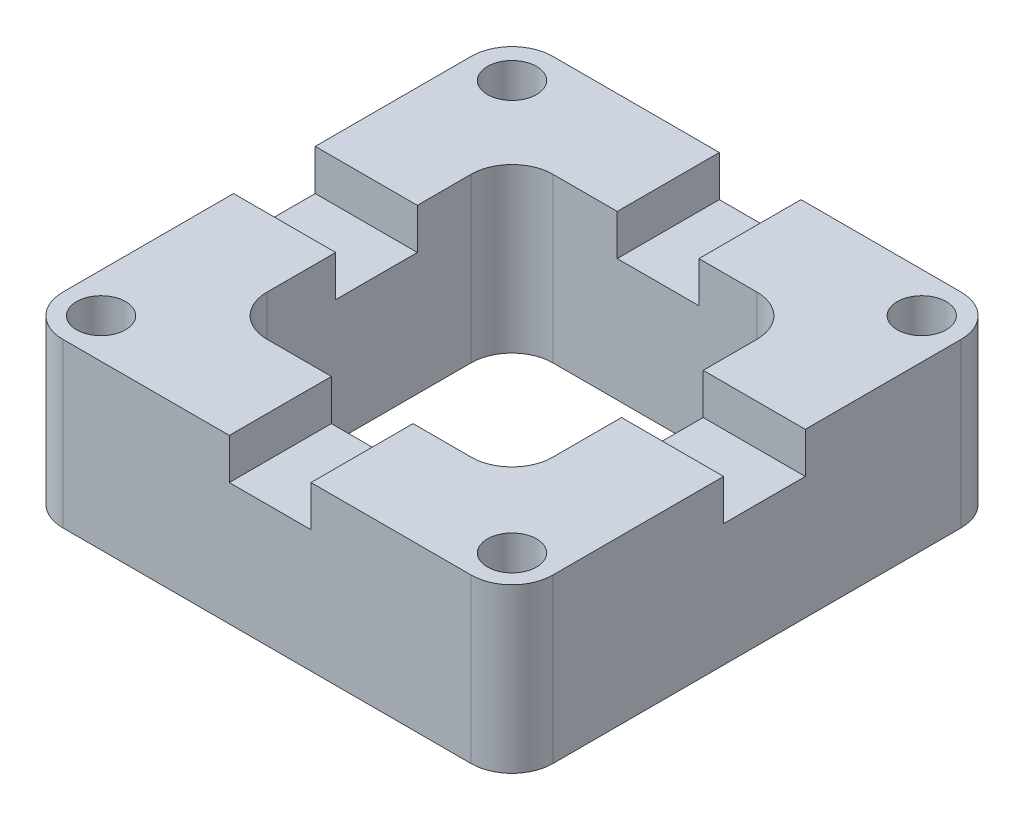
ISO-10303-21;
HEADER;
FILE_DESCRIPTION(('STEP AP214'),'2;1');
FILE_NAME('part.step','',(''),(''),'','','');
FILE_SCHEMA(('AUTOMOTIVE_DESIGN { 1 0 10303 214 1 1 1 1 }'));
ENDSEC;
DATA;
#1=APPLICATION_CONTEXT('core data for automotive mechanical design processes');
#2=APPLICATION_PROTOCOL_DEFINITION('international standard','automotive_design',2000,#1);
#3=PRODUCT_CONTEXT('',#1,'mechanical');
#4=PRODUCT('Part','Part','',(#3));
#5=PRODUCT_RELATED_PRODUCT_CATEGORY('part','',(#4));
#6=PRODUCT_DEFINITION_FORMATION('','',#4);
#7=PRODUCT_DEFINITION_CONTEXT('part definition',#1,'design');
#8=PRODUCT_DEFINITION('design','',#6,#7);
#9=PRODUCT_DEFINITION_SHAPE('','',#8);
#10=(LENGTH_UNIT() NAMED_UNIT(*) SI_UNIT(.MILLI.,.METRE.));
#11=(NAMED_UNIT(*) PLANE_ANGLE_UNIT() SI_UNIT($,.RADIAN.));
#12=(NAMED_UNIT(*) SI_UNIT($,.STERADIAN.) SOLID_ANGLE_UNIT());
#13=UNCERTAINTY_MEASURE_WITH_UNIT(LENGTH_MEASURE(1.E-05),#10,'distance_accuracy_value','');
#14=(GEOMETRIC_REPRESENTATION_CONTEXT(3) GLOBAL_UNCERTAINTY_ASSIGNED_CONTEXT((#13)) GLOBAL_UNIT_ASSIGNED_CONTEXT((#10,
#11,#12)) REPRESENTATION_CONTEXT('',''));
#15=CARTESIAN_POINT('',(0.,0.,0.));
#16=DIRECTION('',(0.,0.,1.));
#17=DIRECTION('',(1.,0.,0.));
#18=AXIS2_PLACEMENT_3D('',#15,#16,#17);
#19=CARTESIAN_POINT('',(0.,30.,0.));
#20=DIRECTION('',(0.,1.,0.));
#21=DIRECTION('',(0.,0.,1.));
#22=AXIS2_PLACEMENT_3D('',#19,#20,#21);
#23=PLANE('',#22);
#24=DIRECTION('',(0.,0.,1.));
#25=VECTOR('',#24,1.);
#26=CARTESIAN_POINT('',(-9.22827384332131,30.,0.));
#27=LINE('',#26,#25);
#28=CARTESIAN_POINT('',(-9.22827384332131,30.,35.));
#29=VERTEX_POINT('',#28);
#30=CARTESIAN_POINT('',(-9.22827384332131,30.,60.));
#31=VERTEX_POINT('',#30);
#32=EDGE_CURVE('E254',#29,#31,#27,.T.);
#33=ORIENTED_EDGE('',*,*,#32,.T.);
#34=DIRECTION('',(1.,0.,0.));
#35=VECTOR('',#34,1.);
#36=CARTESIAN_POINT('',(0.,30.,60.));
#37=LINE('',#36,#35);
#38=CARTESIAN_POINT('',(10.7717261566787,30.,60.));
#39=VERTEX_POINT('',#38);
#40=EDGE_CURVE('E433',#31,#39,#37,.T.);
#41=ORIENTED_EDGE('',*,*,#40,.T.);
#42=DIRECTION('',(0.,0.,-1.));
#43=VECTOR('',#42,1.);
#44=CARTESIAN_POINT('',(10.7717261566787,30.,0.));
#45=LINE('',#44,#43);
#46=CARTESIAN_POINT('',(10.7717261566787,30.,35.));
#47=VERTEX_POINT('',#46);
#48=EDGE_CURVE('E305',#39,#47,#45,.T.);
#49=ORIENTED_EDGE('',*,*,#48,.T.);
#50=DIRECTION('',(1.,0.,0.));
#51=VECTOR('',#50,1.);
#52=CARTESIAN_POINT('',(0.,30.,35.));
#53=LINE('',#52,#51);
#54=EDGE_CURVE('E52',#29,#47,#53,.T.);
#55=ORIENTED_EDGE('',*,*,#54,.F.);
#56=EDGE_LOOP('',(#33,#41,#49,#55));
#57=FACE_BOUND('',#56,.T.);
#58=ADVANCED_FACE('F35',(#57),#23,.T.);
#59=DIRECTION('',(0.,0.,1.));
#60=VECTOR('',#59,1.);
#61=CARTESIAN_POINT('',(35.,30.,0.));
#62=LINE('',#61,#60);
#63=CARTESIAN_POINT('',(35.,30.,-11.8167257989021));
#64=VERTEX_POINT('',#63);
#65=CARTESIAN_POINT('',(35.,30.,8.18327420109791));
#66=VERTEX_POINT('',#65);
#67=EDGE_CURVE('E435',#64,#66,#62,.T.);
#68=ORIENTED_EDGE('',*,*,#67,.T.);
#69=DIRECTION('',(-1.,0.,0.));
#70=VECTOR('',#69,1.);
#71=CARTESIAN_POINT('',(0.,30.,8.18327420109791));
#72=LINE('',#71,#70);
#73=CARTESIAN_POINT('',(60.,30.,8.18327420109791));
#74=VERTEX_POINT('',#73);
#75=EDGE_CURVE('E256',#74,#66,#72,.T.);
#76=ORIENTED_EDGE('',*,*,#75,.F.);
#77=DIRECTION('',(0.,0.,1.));
#78=VECTOR('',#77,1.);
#79=CARTESIAN_POINT('',(60.,30.,0.));
#80=LINE('',#79,#78);
#81=CARTESIAN_POINT('',(60.,30.,-11.8167257989021));
#82=VERTEX_POINT('',#81);
#83=EDGE_CURVE('E424',#82,#74,#80,.T.);
#84=ORIENTED_EDGE('',*,*,#83,.F.);
#85=DIRECTION('',(1.,0.,0.));
#86=VECTOR('',#85,1.);
#87=CARTESIAN_POINT('',(0.,30.,-11.8167257989021));
#88=LINE('',#87,#86);
#89=EDGE_CURVE('E342',#64,#82,#88,.T.);
#90=ORIENTED_EDGE('',*,*,#89,.F.);
#91=EDGE_LOOP('',(#68,#76,#84,#90));
#92=FACE_BOUND('',#91,.T.);
#93=ADVANCED_FACE('F565',(#92),#23,.T.);
#94=DIRECTION('',(1.,0.,0.));
#95=VECTOR('',#94,1.);
#96=CARTESIAN_POINT('',(0.,30.,8.18327420109791));
#97=LINE('',#96,#95);
#98=CARTESIAN_POINT('',(-60.,30.,8.18327420109791));
#99=VERTEX_POINT('',#98);
#100=CARTESIAN_POINT('',(-35.,30.,8.18327420109791));
#101=VERTEX_POINT('',#100);
#102=EDGE_CURVE('E60',#99,#101,#97,.T.);
#103=ORIENTED_EDGE('',*,*,#102,.T.);
#104=DIRECTION('',(0.,0.,1.));
#105=VECTOR('',#104,1.);
#106=CARTESIAN_POINT('',(-35.,30.,0.));
#107=LINE('',#106,#105);
#108=CARTESIAN_POINT('',(-35.,30.,-11.8167257989021));
#109=VERTEX_POINT('',#108);
#110=EDGE_CURVE('E438',#109,#101,#107,.T.);
#111=ORIENTED_EDGE('',*,*,#110,.F.);
#112=DIRECTION('',(-1.,0.,0.));
#113=VECTOR('',#112,1.);
#114=CARTESIAN_POINT('',(0.,30.,-11.8167257989021));
#115=LINE('',#114,#113);
#116=CARTESIAN_POINT('',(-60.,30.,-11.8167257989021));
#117=VERTEX_POINT('',#116);
#118=EDGE_CURVE('E384',#109,#117,#115,.T.);
#119=ORIENTED_EDGE('',*,*,#118,.T.);
#120=DIRECTION('',(0.,0.,1.));
#121=VECTOR('',#120,1.);
#122=CARTESIAN_POINT('',(-60.,30.,0.));
#123=LINE('',#122,#121);
#124=EDGE_CURVE('E431',#117,#99,#123,.T.);
#125=ORIENTED_EDGE('',*,*,#124,.T.);
#126=EDGE_LOOP('',(#103,#111,#119,#125));
#127=FACE_BOUND('',#126,.T.);
#128=ADVANCED_FACE('F571',(#127),#23,.T.);
#129=DIRECTION('',(0.,0.,-1.));
#130=VECTOR('',#129,1.);
#131=CARTESIAN_POINT('',(10.7717261566787,30.,0.));
#132=LINE('',#131,#130);
#133=CARTESIAN_POINT('',(10.7717261566787,30.,-35.));
#134=VERTEX_POINT('',#133);
#135=CARTESIAN_POINT('',(10.7717261566787,30.,-60.));
#136=VERTEX_POINT('',#135);
#137=EDGE_CURVE('E347',#134,#136,#132,.T.);
#138=ORIENTED_EDGE('',*,*,#137,.T.);
#139=DIRECTION('',(1.,0.,0.));
#140=VECTOR('',#139,1.);
#141=CARTESIAN_POINT('',(0.,30.,-60.));
#142=LINE('',#141,#140);
#143=CARTESIAN_POINT('',(-9.22827384332131,30.,-60.));
#144=VERTEX_POINT('',#143);
#145=EDGE_CURVE('E427',#144,#136,#142,.T.);
#146=ORIENTED_EDGE('',*,*,#145,.F.);
#147=DIRECTION('',(0.,0.,1.));
#148=VECTOR('',#147,1.);
#149=CARTESIAN_POINT('',(-9.22827384332131,30.,0.));
#150=LINE('',#149,#148);
#151=CARTESIAN_POINT('',(-9.22827384332131,30.,-35.));
#152=VERTEX_POINT('',#151);
#153=EDGE_CURVE('E389',#144,#152,#150,.T.);
#154=ORIENTED_EDGE('',*,*,#153,.T.);
#155=DIRECTION('',(1.,0.,0.));
#156=VECTOR('',#155,1.);
#157=CARTESIAN_POINT('',(0.,30.,-35.));
#158=LINE('',#157,#156);
#159=EDGE_CURVE('E440',#152,#134,#158,.T.);
#160=ORIENTED_EDGE('',*,*,#159,.T.);
#161=EDGE_LOOP('',(#138,#146,#154,#160));
#162=FACE_BOUND('',#161,.T.);
#163=ADVANCED_FACE('F567',(#162),#23,.T.);
#164=CARTESIAN_POINT('',(25.,30.,-25.));
#165=DIRECTION('',(0.,-1.,0.));
#166=DIRECTION('',(0.,0.,-1.));
#167=AXIS2_PLACEMENT_3D('',#164,#165,#166);
#168=CYLINDRICAL_SURFACE('',#167,10.);
#169=CARTESIAN_POINT('',(25.,0.,-25.));
#170=DIRECTION('',(0.,1.,0.));
#171=DIRECTION('',(0.,0.,1.));
#172=AXIS2_PLACEMENT_3D('',#169,#170,#171);
#173=CIRCLE('',#172,10.);
#174=CARTESIAN_POINT('',(25.,0.,-35.));
#175=VERTEX_POINT('',#174);
#176=CARTESIAN_POINT('',(35.,0.,-25.));
#177=VERTEX_POINT('',#176);
#178=EDGE_CURVE('E465',#175,#177,#173,.F.);
#179=ORIENTED_EDGE('',*,*,#178,.T.);
#180=DIRECTION('',(0.,-1.,0.));
#181=VECTOR('',#180,1.);
#182=CARTESIAN_POINT('',(35.,30.,-25.));
#183=LINE('',#182,#181);
#184=CARTESIAN_POINT('',(35.,40.,-25.));
#185=VERTEX_POINT('',#184);
#186=EDGE_CURVE('E11',#185,#177,#183,.T.);
#187=ORIENTED_EDGE('',*,*,#186,.F.);
#188=CARTESIAN_POINT('',(25.,40.,-25.));
#189=DIRECTION('',(0.,1.,0.));
#190=DIRECTION('',(0.,0.,1.));
#191=AXIS2_PLACEMENT_3D('',#188,#189,#190);
#192=CIRCLE('',#191,10.);
#193=CARTESIAN_POINT('',(25.,40.,-35.));
#194=VERTEX_POINT('',#193);
#195=EDGE_CURVE('E366',#194,#185,#192,.F.);
#196=ORIENTED_EDGE('',*,*,#195,.F.);
#197=DIRECTION('',(0.,-1.,0.));
#198=VECTOR('',#197,1.);
#199=CARTESIAN_POINT('',(25.,30.,-35.));
#200=LINE('',#199,#198);
#201=EDGE_CURVE('E496',#194,#175,#200,.T.);
#202=ORIENTED_EDGE('',*,*,#201,.T.);
#203=EDGE_LOOP('',(#179,#187,#196,#202));
#204=FACE_BOUND('',#203,.T.);
#205=ADVANCED_FACE('F576',(#204),#168,.F.);
#206=CARTESIAN_POINT('',(35.,30.,0.));
#207=DIRECTION('',(1.,0.,0.));
#208=DIRECTION('',(0.,0.,-1.));
#209=AXIS2_PLACEMENT_3D('',#206,#207,#208);
#210=PLANE('',#209);
#211=DIRECTION('',(0.,0.,1.));
#212=VECTOR('',#211,1.);
#213=CARTESIAN_POINT('',(35.,0.,0.));
#214=LINE('',#213,#212);
#215=CARTESIAN_POINT('',(35.,0.,25.));
#216=VERTEX_POINT('',#215);
#217=EDGE_CURVE('E468',#177,#216,#214,.T.);
#218=ORIENTED_EDGE('',*,*,#217,.T.);
#219=DIRECTION('',(0.,-1.,0.));
#220=VECTOR('',#219,1.);
#221=CARTESIAN_POINT('',(35.,30.,25.));
#222=LINE('',#221,#220);
#223=CARTESIAN_POINT('',(35.,40.,25.));
#224=VERTEX_POINT('',#223);
#225=EDGE_CURVE('E44',#224,#216,#222,.T.);
#226=ORIENTED_EDGE('',*,*,#225,.F.);
#227=DIRECTION('',(0.,0.,1.));
#228=VECTOR('',#227,1.);
#229=CARTESIAN_POINT('',(35.,40.,0.));
#230=LINE('',#229,#228);
#231=CARTESIAN_POINT('',(35.,40.,8.18327420109791));
#232=VERTEX_POINT('',#231);
#233=EDGE_CURVE('E310',#232,#224,#230,.T.);
#234=ORIENTED_EDGE('',*,*,#233,.F.);
#235=DIRECTION('',(0.,-1.,0.));
#236=VECTOR('',#235,1.);
#237=CARTESIAN_POINT('',(35.,40.,8.18327420109791));
#238=LINE('',#237,#236);
#239=EDGE_CURVE('E336',#232,#66,#238,.T.);
#240=ORIENTED_EDGE('',*,*,#239,.T.);
#241=ORIENTED_EDGE('',*,*,#67,.F.);
#242=DIRECTION('',(0.,-1.,0.));
#243=VECTOR('',#242,1.);
#244=CARTESIAN_POINT('',(35.,40.,-11.8167257989021));
#245=LINE('',#244,#243);
#246=CARTESIAN_POINT('',(35.,40.,-11.8167257989021));
#247=VERTEX_POINT('',#246);
#248=EDGE_CURVE('E381',#247,#64,#245,.T.);
#249=ORIENTED_EDGE('',*,*,#248,.F.);
#250=DIRECTION('',(0.,0.,1.));
#251=VECTOR('',#250,1.);
#252=CARTESIAN_POINT('',(35.,40.,0.));
#253=LINE('',#252,#251);
#254=EDGE_CURVE('E346',#185,#247,#253,.T.);
#255=ORIENTED_EDGE('',*,*,#254,.F.);
#256=ORIENTED_EDGE('',*,*,#186,.T.);
#257=EDGE_LOOP('',(#218,#226,#234,#240,#241,#249,#255,#256));
#258=FACE_BOUND('',#257,.T.);
#259=ADVANCED_FACE('F582',(#258),#210,.F.);
#260=CARTESIAN_POINT('',(25.,30.,25.));
#261=DIRECTION('',(0.,-1.,0.));
#262=DIRECTION('',(0.,0.,-1.));
#263=AXIS2_PLACEMENT_3D('',#260,#261,#262);
#264=CYLINDRICAL_SURFACE('',#263,10.);
#265=CARTESIAN_POINT('',(25.,0.,25.));
#266=DIRECTION('',(0.,1.,0.));
#267=DIRECTION('',(0.,0.,1.));
#268=AXIS2_PLACEMENT_3D('',#265,#266,#267);
#269=CIRCLE('',#268,10.);
#270=CARTESIAN_POINT('',(25.,0.,35.));
#271=VERTEX_POINT('',#270);
#272=EDGE_CURVE('E471',#271,#216,#269,.T.);
#273=ORIENTED_EDGE('',*,*,#272,.F.);
#274=DIRECTION('',(0.,-1.,0.));
#275=VECTOR('',#274,1.);
#276=CARTESIAN_POINT('',(25.,30.,35.));
#277=LINE('',#276,#275);
#278=CARTESIAN_POINT('',(25.,40.,35.));
#279=VERTEX_POINT('',#278);
#280=EDGE_CURVE('E506',#279,#271,#277,.T.);
#281=ORIENTED_EDGE('',*,*,#280,.F.);
#282=CARTESIAN_POINT('',(25.,40.,25.));
#283=DIRECTION('',(0.,1.,0.));
#284=DIRECTION('',(0.,0.,1.));
#285=AXIS2_PLACEMENT_3D('',#282,#283,#284);
#286=CIRCLE('',#285,10.);
#287=EDGE_CURVE('E313',#224,#279,#286,.F.);
#288=ORIENTED_EDGE('',*,*,#287,.F.);
#289=ORIENTED_EDGE('',*,*,#225,.T.);
#290=EDGE_LOOP('',(#273,#281,#288,#289));
#291=FACE_BOUND('',#290,.T.);
#292=ADVANCED_FACE('F622',(#291),#264,.F.);
#293=CARTESIAN_POINT('',(0.,30.,35.));
#294=DIRECTION('',(0.,0.,-1.));
#295=DIRECTION('',(-1.,0.,0.));
#296=AXIS2_PLACEMENT_3D('',#293,#294,#295);
#297=PLANE('',#296);
#298=DIRECTION('',(1.,0.,0.));
#299=VECTOR('',#298,1.);
#300=CARTESIAN_POINT('',(0.,0.,35.));
#301=LINE('',#300,#299);
#302=CARTESIAN_POINT('',(-25.,0.,35.));
#303=VERTEX_POINT('',#302);
#304=EDGE_CURVE('E474',#303,#271,#301,.T.);
#305=ORIENTED_EDGE('',*,*,#304,.F.);
#306=DIRECTION('',(0.,-1.,0.));
#307=VECTOR('',#306,1.);
#308=CARTESIAN_POINT('',(-25.,30.,35.));
#309=LINE('',#308,#307);
#310=CARTESIAN_POINT('',(-25.,40.,35.));
#311=VERTEX_POINT('',#310);
#312=EDGE_CURVE('E263',#311,#303,#309,.T.);
#313=ORIENTED_EDGE('',*,*,#312,.F.);
#314=DIRECTION('',(-1.,0.,0.));
#315=VECTOR('',#314,1.);
#316=CARTESIAN_POINT('',(0.,40.,35.));
#317=LINE('',#316,#315);
#318=CARTESIAN_POINT('',(-9.22827384332131,40.,35.));
#319=VERTEX_POINT('',#318);
#320=EDGE_CURVE('E260',#319,#311,#317,.T.);
#321=ORIENTED_EDGE('',*,*,#320,.F.);
#322=DIRECTION('',(0.,-1.,0.));
#323=VECTOR('',#322,1.);
#324=CARTESIAN_POINT('',(-9.22827384332131,40.,35.));
#325=LINE('',#324,#323);
#326=EDGE_CURVE('E248',#319,#29,#325,.T.);
#327=ORIENTED_EDGE('',*,*,#326,.T.);
#328=ORIENTED_EDGE('',*,*,#54,.T.);
#329=DIRECTION('',(0.,-1.,0.));
#330=VECTOR('',#329,1.);
#331=CARTESIAN_POINT('',(10.7717261566787,40.,35.));
#332=LINE('',#331,#330);
#333=CARTESIAN_POINT('',(10.7717261566787,40.,35.));
#334=VERTEX_POINT('',#333);
#335=EDGE_CURVE('E333',#334,#47,#332,.T.);
#336=ORIENTED_EDGE('',*,*,#335,.F.);
#337=DIRECTION('',(-1.,0.,0.));
#338=VECTOR('',#337,1.);
#339=CARTESIAN_POINT('',(0.,40.,35.));
#340=LINE('',#339,#338);
#341=EDGE_CURVE('E316',#279,#334,#340,.T.);
#342=ORIENTED_EDGE('',*,*,#341,.F.);
#343=ORIENTED_EDGE('',*,*,#280,.T.);
#344=EDGE_LOOP('',(#305,#313,#321,#327,#328,#336,#342,#343));
#345=FACE_BOUND('',#344,.T.);
#346=ADVANCED_FACE('F262',(#345),#297,.T.);
#347=CARTESIAN_POINT('',(-25.,30.,25.));
#348=DIRECTION('',(0.,-1.,0.));
#349=DIRECTION('',(0.,0.,-1.));
#350=AXIS2_PLACEMENT_3D('',#347,#348,#349);
#351=CYLINDRICAL_SURFACE('',#350,10.);
#352=CARTESIAN_POINT('',(-25.,0.,25.));
#353=DIRECTION('',(0.,1.,0.));
#354=DIRECTION('',(0.,0.,1.));
#355=AXIS2_PLACEMENT_3D('',#352,#353,#354);
#356=CIRCLE('',#355,10.);
#357=CARTESIAN_POINT('',(-35.,0.,25.));
#358=VERTEX_POINT('',#357);
#359=EDGE_CURVE('E477',#358,#303,#356,.T.);
#360=ORIENTED_EDGE('',*,*,#359,.F.);
#361=DIRECTION('',(0.,-1.,0.));
#362=VECTOR('',#361,1.);
#363=CARTESIAN_POINT('',(-35.,30.,25.));
#364=LINE('',#363,#362);
#365=CARTESIAN_POINT('',(-35.,40.,25.));
#366=VERTEX_POINT('',#365);
#367=EDGE_CURVE('E503',#366,#358,#364,.T.);
#368=ORIENTED_EDGE('',*,*,#367,.F.);
#369=CARTESIAN_POINT('',(-25.,40.,25.));
#370=DIRECTION('',(0.,1.,0.));
#371=DIRECTION('',(0.,0.,1.));
#372=AXIS2_PLACEMENT_3D('',#369,#370,#371);
#373=CIRCLE('',#372,10.);
#374=EDGE_CURVE('E267',#311,#366,#373,.F.);
#375=ORIENTED_EDGE('',*,*,#374,.F.);
#376=ORIENTED_EDGE('',*,*,#312,.T.);
#377=EDGE_LOOP('',(#360,#368,#375,#376));
#378=FACE_BOUND('',#377,.T.);
#379=ADVANCED_FACE('F629',(#378),#351,.F.);
#380=CARTESIAN_POINT('',(-35.,30.,0.));
#381=DIRECTION('',(1.,0.,0.));
#382=DIRECTION('',(0.,0.,-1.));
#383=AXIS2_PLACEMENT_3D('',#380,#381,#382);
#384=PLANE('',#383);
#385=DIRECTION('',(0.,0.,1.));
#386=VECTOR('',#385,1.);
#387=CARTESIAN_POINT('',(-35.,0.,0.));
#388=LINE('',#387,#386);
#389=CARTESIAN_POINT('',(-35.,0.,-25.));
#390=VERTEX_POINT('',#389);
#391=EDGE_CURVE('E480',#390,#358,#388,.T.);
#392=ORIENTED_EDGE('',*,*,#391,.F.);
#393=DIRECTION('',(0.,-1.,0.));
#394=VECTOR('',#393,1.);
#395=CARTESIAN_POINT('',(-35.,30.,-25.));
#396=LINE('',#395,#394);
#397=CARTESIAN_POINT('',(-35.,40.,-25.));
#398=VERTEX_POINT('',#397);
#399=EDGE_CURVE('E501',#398,#390,#396,.T.);
#400=ORIENTED_EDGE('',*,*,#399,.F.);
#401=DIRECTION('',(0.,0.,-1.));
#402=VECTOR('',#401,1.);
#403=CARTESIAN_POINT('',(-35.,40.,0.));
#404=LINE('',#403,#402);
#405=CARTESIAN_POINT('',(-35.,40.,-11.8167257989021));
#406=VERTEX_POINT('',#405);
#407=EDGE_CURVE('E388',#406,#398,#404,.T.);
#408=ORIENTED_EDGE('',*,*,#407,.F.);
#409=DIRECTION('',(0.,-1.,0.));
#410=VECTOR('',#409,1.);
#411=CARTESIAN_POINT('',(-35.,40.,-11.8167257989021));
#412=LINE('',#411,#410);
#413=EDGE_CURVE('E421',#406,#109,#412,.T.);
#414=ORIENTED_EDGE('',*,*,#413,.T.);
#415=ORIENTED_EDGE('',*,*,#110,.T.);
#416=DIRECTION('',(0.,-1.,0.));
#417=VECTOR('',#416,1.);
#418=CARTESIAN_POINT('',(-35.,40.,8.18327420109791));
#419=LINE('',#418,#417);
#420=CARTESIAN_POINT('',(-35.,40.,8.18327420109791));
#421=VERTEX_POINT('',#420);
#422=EDGE_CURVE('E257',#421,#101,#419,.T.);
#423=ORIENTED_EDGE('',*,*,#422,.F.);
#424=DIRECTION('',(0.,0.,-1.));
#425=VECTOR('',#424,1.);
#426=CARTESIAN_POINT('',(-35.,40.,0.));
#427=LINE('',#426,#425);
#428=EDGE_CURVE('E279',#366,#421,#427,.T.);
#429=ORIENTED_EDGE('',*,*,#428,.F.);
#430=ORIENTED_EDGE('',*,*,#367,.T.);
#431=EDGE_LOOP('',(#392,#400,#408,#414,#415,#423,#429,#430));
#432=FACE_BOUND('',#431,.T.);
#433=ADVANCED_FACE('F634',(#432),#384,.T.);
#434=CARTESIAN_POINT('',(-25.,30.,-25.));
#435=DIRECTION('',(0.,-1.,0.));
#436=DIRECTION('',(0.,0.,-1.));
#437=AXIS2_PLACEMENT_3D('',#434,#435,#436);
#438=CYLINDRICAL_SURFACE('',#437,10.);
#439=CARTESIAN_POINT('',(-25.,0.,-25.));
#440=DIRECTION('',(0.,1.,0.));
#441=DIRECTION('',(0.,0.,1.));
#442=AXIS2_PLACEMENT_3D('',#439,#440,#441);
#443=CIRCLE('',#442,10.);
#444=CARTESIAN_POINT('',(-25.,0.,-35.));
#445=VERTEX_POINT('',#444);
#446=EDGE_CURVE('E483',#445,#390,#443,.T.);
#447=ORIENTED_EDGE('',*,*,#446,.F.);
#448=DIRECTION('',(0.,-1.,0.));
#449=VECTOR('',#448,1.);
#450=CARTESIAN_POINT('',(-25.,30.,-35.));
#451=LINE('',#450,#449);
#452=CARTESIAN_POINT('',(-25.,40.,-35.));
#453=VERTEX_POINT('',#452);
#454=EDGE_CURVE('E499',#453,#445,#451,.T.);
#455=ORIENTED_EDGE('',*,*,#454,.F.);
#456=CARTESIAN_POINT('',(-25.,40.,-25.));
#457=DIRECTION('',(0.,1.,0.));
#458=DIRECTION('',(0.,0.,1.));
#459=AXIS2_PLACEMENT_3D('',#456,#457,#458);
#460=CIRCLE('',#459,10.);
#461=EDGE_CURVE('E392',#398,#453,#460,.F.);
#462=ORIENTED_EDGE('',*,*,#461,.F.);
#463=ORIENTED_EDGE('',*,*,#399,.T.);
#464=EDGE_LOOP('',(#447,#455,#462,#463));
#465=FACE_BOUND('',#464,.T.);
#466=ADVANCED_FACE('F647',(#465),#438,.F.);
#467=CARTESIAN_POINT('',(60.,30.,0.));
#468=DIRECTION('',(1.,0.,0.));
#469=DIRECTION('',(0.,0.,-1.));
#470=AXIS2_PLACEMENT_3D('',#467,#468,#469);
#471=PLANE('',#470);
#472=DIRECTION('',(0.,0.,1.));
#473=VECTOR('',#472,1.);
#474=CARTESIAN_POINT('',(60.,0.,0.));
#475=LINE('',#474,#473);
#476=CARTESIAN_POINT('',(60.,0.,-50.));
#477=VERTEX_POINT('',#476);
#478=CARTESIAN_POINT('',(60.,0.,50.));
#479=VERTEX_POINT('',#478);
#480=EDGE_CURVE('E423',#477,#479,#475,.T.);
#481=ORIENTED_EDGE('',*,*,#480,.F.);
#482=DIRECTION('',(0.,-1.,0.));
#483=VECTOR('',#482,1.);
#484=CARTESIAN_POINT('',(60.,30.,-50.));
#485=LINE('',#484,#483);
#486=CARTESIAN_POINT('',(60.,40.,-50.));
#487=VERTEX_POINT('',#486);
#488=EDGE_CURVE('E39',#487,#477,#485,.T.);
#489=ORIENTED_EDGE('',*,*,#488,.F.);
#490=DIRECTION('',(0.,0.,-1.));
#491=VECTOR('',#490,1.);
#492=CARTESIAN_POINT('',(60.,40.,0.));
#493=LINE('',#492,#491);
#494=CARTESIAN_POINT('',(60.,40.,-11.8167257989021));
#495=VERTEX_POINT('',#494);
#496=EDGE_CURVE('E352',#495,#487,#493,.T.);
#497=ORIENTED_EDGE('',*,*,#496,.F.);
#498=DIRECTION('',(0.,-1.,0.));
#499=VECTOR('',#498,1.);
#500=CARTESIAN_POINT('',(60.,40.,-11.8167257989021));
#501=LINE('',#500,#499);
#502=EDGE_CURVE('E378',#495,#82,#501,.T.);
#503=ORIENTED_EDGE('',*,*,#502,.T.);
#504=ORIENTED_EDGE('',*,*,#83,.T.);
#505=DIRECTION('',(0.,-1.,0.));
#506=VECTOR('',#505,1.);
#507=CARTESIAN_POINT('',(60.,40.,8.18327420109791));
#508=LINE('',#507,#506);
#509=CARTESIAN_POINT('',(60.,40.,8.18327420109791));
#510=VERTEX_POINT('',#509);
#511=EDGE_CURVE('E339',#510,#74,#508,.T.);
#512=ORIENTED_EDGE('',*,*,#511,.F.);
#513=DIRECTION('',(0.,0.,-1.));
#514=VECTOR('',#513,1.);
#515=CARTESIAN_POINT('',(60.,40.,0.));
#516=LINE('',#515,#514);
#517=CARTESIAN_POINT('',(60.,40.,50.));
#518=VERTEX_POINT('',#517);
#519=EDGE_CURVE('E304',#518,#510,#516,.T.);
#520=ORIENTED_EDGE('',*,*,#519,.F.);
#521=DIRECTION('',(0.,-1.,0.));
#522=VECTOR('',#521,1.);
#523=CARTESIAN_POINT('',(60.,30.,50.));
#524=LINE('',#523,#522);
#525=EDGE_CURVE('E442',#518,#479,#524,.T.);
#526=ORIENTED_EDGE('',*,*,#525,.T.);
#527=EDGE_LOOP('',(#481,#489,#497,#503,#504,#512,#520,#526));
#528=FACE_BOUND('',#527,.T.);
#529=ADVANCED_FACE('F37',(#528),#471,.T.);
#530=CARTESIAN_POINT('',(50.,30.,-50.));
#531=DIRECTION('',(0.,-1.,0.));
#532=DIRECTION('',(0.,0.,-1.));
#533=AXIS2_PLACEMENT_3D('',#530,#531,#532);
#534=CYLINDRICAL_SURFACE('',#533,10.);
#535=CARTESIAN_POINT('',(50.,0.,-50.));
#536=DIRECTION('',(0.,1.,0.));
#537=DIRECTION('',(0.,0.,1.));
#538=AXIS2_PLACEMENT_3D('',#535,#536,#537);
#539=CIRCLE('',#538,10.);
#540=CARTESIAN_POINT('',(50.,0.,-60.));
#541=VERTEX_POINT('',#540);
#542=EDGE_CURVE('E445',#541,#477,#539,.F.);
#543=ORIENTED_EDGE('',*,*,#542,.F.);
#544=DIRECTION('',(0.,-1.,0.));
#545=VECTOR('',#544,1.);
#546=CARTESIAN_POINT('',(50.,30.,-60.));
#547=LINE('',#546,#545);
#548=CARTESIAN_POINT('',(50.,40.,-60.));
#549=VERTEX_POINT('',#548);
#550=EDGE_CURVE('E523',#549,#541,#547,.T.);
#551=ORIENTED_EDGE('',*,*,#550,.F.);
#552=CARTESIAN_POINT('',(50.,40.,-50.));
#553=DIRECTION('',(0.,1.,0.));
#554=DIRECTION('',(0.,0.,1.));
#555=AXIS2_PLACEMENT_3D('',#552,#553,#554);
#556=CIRCLE('',#555,10.);
#557=EDGE_CURVE('E355',#487,#549,#556,.T.);
#558=ORIENTED_EDGE('',*,*,#557,.F.);
#559=ORIENTED_EDGE('',*,*,#488,.T.);
#560=EDGE_LOOP('',(#543,#551,#558,#559));
#561=FACE_BOUND('',#560,.T.);
#562=ADVANCED_FACE('F531',(#561),#534,.T.);
#563=CARTESIAN_POINT('',(0.,30.,-60.));
#564=DIRECTION('',(0.,0.,-1.));
#565=DIRECTION('',(-1.,0.,0.));
#566=AXIS2_PLACEMENT_3D('',#563,#564,#565);
#567=PLANE('',#566);
#568=DIRECTION('',(1.,0.,0.));
#569=VECTOR('',#568,1.);
#570=CARTESIAN_POINT('',(0.,0.,-60.));
#571=LINE('',#570,#569);
#572=CARTESIAN_POINT('',(-50.,0.,-60.));
#573=VERTEX_POINT('',#572);
#574=EDGE_CURVE('E448',#573,#541,#571,.T.);
#575=ORIENTED_EDGE('',*,*,#574,.F.);
#576=DIRECTION('',(0.,-1.,0.));
#577=VECTOR('',#576,1.);
#578=CARTESIAN_POINT('',(-50.,30.,-60.));
#579=LINE('',#578,#577);
#580=CARTESIAN_POINT('',(-50.,40.,-60.));
#581=VERTEX_POINT('',#580);
#582=EDGE_CURVE('E522',#581,#573,#579,.T.);
#583=ORIENTED_EDGE('',*,*,#582,.F.);
#584=DIRECTION('',(-1.,0.,0.));
#585=VECTOR('',#584,1.);
#586=CARTESIAN_POINT('',(0.,40.,-60.));
#587=LINE('',#586,#585);
#588=CARTESIAN_POINT('',(-9.22827384332131,40.,-60.));
#589=VERTEX_POINT('',#588);
#590=EDGE_CURVE('E400',#589,#581,#587,.T.);
#591=ORIENTED_EDGE('',*,*,#590,.F.);
#592=DIRECTION('',(0.,-1.,0.));
#593=VECTOR('',#592,1.);
#594=CARTESIAN_POINT('',(-9.22827384332131,40.,-60.));
#595=LINE('',#594,#593);
#596=EDGE_CURVE('E417',#589,#144,#595,.T.);
#597=ORIENTED_EDGE('',*,*,#596,.T.);
#598=ORIENTED_EDGE('',*,*,#145,.T.);
#599=DIRECTION('',(0.,-1.,0.));
#600=VECTOR('',#599,1.);
#601=CARTESIAN_POINT('',(10.7717261566787,40.,-60.));
#602=LINE('',#601,#600);
#603=CARTESIAN_POINT('',(10.7717261566787,40.,-60.));
#604=VERTEX_POINT('',#603);
#605=EDGE_CURVE('E375',#604,#136,#602,.T.);
#606=ORIENTED_EDGE('',*,*,#605,.F.);
#607=DIRECTION('',(-1.,0.,0.));
#608=VECTOR('',#607,1.);
#609=CARTESIAN_POINT('',(0.,40.,-60.));
#610=LINE('',#609,#608);
#611=EDGE_CURVE('E358',#549,#604,#610,.T.);
#612=ORIENTED_EDGE('',*,*,#611,.F.);
#613=ORIENTED_EDGE('',*,*,#550,.T.);
#614=EDGE_LOOP('',(#575,#583,#591,#597,#598,#606,#612,#613));
#615=FACE_BOUND('',#614,.T.);
#616=ADVANCED_FACE('F541',(#615),#567,.T.);
#617=CARTESIAN_POINT('',(-50.,30.,-50.));
#618=DIRECTION('',(0.,-1.,0.));
#619=DIRECTION('',(0.,0.,-1.));
#620=AXIS2_PLACEMENT_3D('',#617,#618,#619);
#621=CYLINDRICAL_SURFACE('',#620,10.);
#622=CARTESIAN_POINT('',(-50.,0.,-50.));
#623=DIRECTION('',(0.,1.,0.));
#624=DIRECTION('',(0.,0.,1.));
#625=AXIS2_PLACEMENT_3D('',#622,#623,#624);
#626=CIRCLE('',#625,10.);
#627=CARTESIAN_POINT('',(-60.,0.,-50.));
#628=VERTEX_POINT('',#627);
#629=EDGE_CURVE('E451',#573,#628,#626,.T.);
#630=ORIENTED_EDGE('',*,*,#629,.T.);
#631=DIRECTION('',(0.,-1.,0.));
#632=VECTOR('',#631,1.);
#633=CARTESIAN_POINT('',(-60.,30.,-50.));
#634=LINE('',#633,#632);
#635=CARTESIAN_POINT('',(-60.,40.,-50.));
#636=VERTEX_POINT('',#635);
#637=EDGE_CURVE('E519',#636,#628,#634,.T.);
#638=ORIENTED_EDGE('',*,*,#637,.F.);
#639=CARTESIAN_POINT('',(-50.,40.,-50.));
#640=DIRECTION('',(0.,1.,0.));
#641=DIRECTION('',(0.,0.,1.));
#642=AXIS2_PLACEMENT_3D('',#639,#640,#641);
#643=CIRCLE('',#642,10.);
#644=EDGE_CURVE('E403',#581,#636,#643,.T.);
#645=ORIENTED_EDGE('',*,*,#644,.F.);
#646=ORIENTED_EDGE('',*,*,#582,.T.);
#647=EDGE_LOOP('',(#630,#638,#645,#646));
#648=FACE_BOUND('',#647,.T.);
#649=ADVANCED_FACE('F551',(#648),#621,.T.);
#650=CARTESIAN_POINT('',(-60.,30.,0.));
#651=DIRECTION('',(1.,0.,0.));
#652=DIRECTION('',(0.,0.,-1.));
#653=AXIS2_PLACEMENT_3D('',#650,#651,#652);
#654=PLANE('',#653);
#655=DIRECTION('',(0.,0.,1.));
#656=VECTOR('',#655,1.);
#657=CARTESIAN_POINT('',(-60.,0.,0.));
#658=LINE('',#657,#656);
#659=CARTESIAN_POINT('',(-60.,0.,50.));
#660=VERTEX_POINT('',#659);
#661=EDGE_CURVE('E453',#628,#660,#658,.T.);
#662=ORIENTED_EDGE('',*,*,#661,.T.);
#663=DIRECTION('',(0.,-1.,0.));
#664=VECTOR('',#663,1.);
#665=CARTESIAN_POINT('',(-60.,30.,50.));
#666=LINE('',#665,#664);
#667=CARTESIAN_POINT('',(-60.,40.,50.));
#668=VERTEX_POINT('',#667);
#669=EDGE_CURVE('E516',#668,#660,#666,.T.);
#670=ORIENTED_EDGE('',*,*,#669,.F.);
#671=DIRECTION('',(0.,0.,1.));
#672=VECTOR('',#671,1.);
#673=CARTESIAN_POINT('',(-60.,40.,0.));
#674=LINE('',#673,#672);
#675=CARTESIAN_POINT('',(-60.,40.,8.18327420109791));
#676=VERTEX_POINT('',#675);
#677=EDGE_CURVE('E284',#676,#668,#674,.T.);
#678=ORIENTED_EDGE('',*,*,#677,.F.);
#679=DIRECTION('',(0.,-1.,0.));
#680=VECTOR('',#679,1.);
#681=CARTESIAN_POINT('',(-60.,40.,8.18327420109791));
#682=LINE('',#681,#680);
#683=EDGE_CURVE('E296',#676,#99,#682,.T.);
#684=ORIENTED_EDGE('',*,*,#683,.T.);
#685=ORIENTED_EDGE('',*,*,#124,.F.);
#686=DIRECTION('',(0.,-1.,0.));
#687=VECTOR('',#686,1.);
#688=CARTESIAN_POINT('',(-60.,40.,-11.8167257989021));
#689=LINE('',#688,#687);
#690=CARTESIAN_POINT('',(-60.,40.,-11.8167257989021));
#691=VERTEX_POINT('',#690);
#692=EDGE_CURVE('E411',#691,#117,#689,.T.);
#693=ORIENTED_EDGE('',*,*,#692,.F.);
#694=DIRECTION('',(0.,0.,1.));
#695=VECTOR('',#694,1.);
#696=CARTESIAN_POINT('',(-60.,40.,0.));
#697=LINE('',#696,#695);
#698=EDGE_CURVE('E406',#636,#691,#697,.T.);
#699=ORIENTED_EDGE('',*,*,#698,.F.);
#700=ORIENTED_EDGE('',*,*,#637,.T.);
#701=EDGE_LOOP('',(#662,#670,#678,#684,#685,#693,#699,#700));
#702=FACE_BOUND('',#701,.T.);
#703=ADVANCED_FACE('F553',(#702),#654,.F.);
#704=CARTESIAN_POINT('',(-50.,30.,50.));
#705=DIRECTION('',(0.,-1.,0.));
#706=DIRECTION('',(0.,0.,-1.));
#707=AXIS2_PLACEMENT_3D('',#704,#705,#706);
#708=CYLINDRICAL_SURFACE('',#707,10.);
#709=CARTESIAN_POINT('',(-50.,0.,50.));
#710=DIRECTION('',(0.,1.,0.));
#711=DIRECTION('',(0.,0.,1.));
#712=AXIS2_PLACEMENT_3D('',#709,#710,#711);
#713=CIRCLE('',#712,10.);
#714=CARTESIAN_POINT('',(-50.,0.,60.));
#715=VERTEX_POINT('',#714);
#716=EDGE_CURVE('E455',#660,#715,#713,.T.);
#717=ORIENTED_EDGE('',*,*,#716,.T.);
#718=DIRECTION('',(0.,-1.,0.));
#719=VECTOR('',#718,1.);
#720=CARTESIAN_POINT('',(-50.,30.,60.));
#721=LINE('',#720,#719);
#722=CARTESIAN_POINT('',(-50.,40.,60.));
#723=VERTEX_POINT('',#722);
#724=EDGE_CURVE('E513',#723,#715,#721,.T.);
#725=ORIENTED_EDGE('',*,*,#724,.F.);
#726=CARTESIAN_POINT('',(-50.,40.,50.));
#727=DIRECTION('',(0.,1.,0.));
#728=DIRECTION('',(0.,0.,1.));
#729=AXIS2_PLACEMENT_3D('',#726,#727,#728);
#730=CIRCLE('',#729,10.);
#731=EDGE_CURVE('E287',#668,#723,#730,.T.);
#732=ORIENTED_EDGE('',*,*,#731,.F.);
#733=ORIENTED_EDGE('',*,*,#669,.T.);
#734=EDGE_LOOP('',(#717,#725,#732,#733));
#735=FACE_BOUND('',#734,.T.);
#736=ADVANCED_FACE('F558',(#735),#708,.T.);
#737=CARTESIAN_POINT('',(0.,30.,60.));
#738=DIRECTION('',(0.,0.,-1.));
#739=DIRECTION('',(-1.,0.,0.));
#740=AXIS2_PLACEMENT_3D('',#737,#738,#739);
#741=PLANE('',#740);
#742=DIRECTION('',(1.,0.,0.));
#743=VECTOR('',#742,1.);
#744=CARTESIAN_POINT('',(0.,0.,60.));
#745=LINE('',#744,#743);
#746=CARTESIAN_POINT('',(50.,0.,60.));
#747=VERTEX_POINT('',#746);
#748=EDGE_CURVE('E457',#715,#747,#745,.T.);
#749=ORIENTED_EDGE('',*,*,#748,.T.);
#750=DIRECTION('',(0.,-1.,0.));
#751=VECTOR('',#750,1.);
#752=CARTESIAN_POINT('',(50.,30.,60.));
#753=LINE('',#752,#751);
#754=CARTESIAN_POINT('',(50.,40.,60.));
#755=VERTEX_POINT('',#754);
#756=EDGE_CURVE('E510',#755,#747,#753,.T.);
#757=ORIENTED_EDGE('',*,*,#756,.F.);
#758=DIRECTION('',(1.,0.,0.));
#759=VECTOR('',#758,1.);
#760=CARTESIAN_POINT('',(0.,40.,60.));
#761=LINE('',#760,#759);
#762=CARTESIAN_POINT('',(10.7717261566787,40.,60.));
#763=VERTEX_POINT('',#762);
#764=EDGE_CURVE('E321',#763,#755,#761,.T.);
#765=ORIENTED_EDGE('',*,*,#764,.F.);
#766=DIRECTION('',(0.,-1.,0.));
#767=VECTOR('',#766,1.);
#768=CARTESIAN_POINT('',(10.7717261566787,40.,60.));
#769=LINE('',#768,#767);
#770=EDGE_CURVE('E327',#763,#39,#769,.T.);
#771=ORIENTED_EDGE('',*,*,#770,.T.);
#772=ORIENTED_EDGE('',*,*,#40,.F.);
#773=DIRECTION('',(0.,-1.,0.));
#774=VECTOR('',#773,1.);
#775=CARTESIAN_POINT('',(-9.22827384332131,40.,60.));
#776=LINE('',#775,#774);
#777=CARTESIAN_POINT('',(-9.22827384332131,40.,60.));
#778=VERTEX_POINT('',#777);
#779=EDGE_CURVE('E293',#778,#31,#776,.T.);
#780=ORIENTED_EDGE('',*,*,#779,.F.);
#781=DIRECTION('',(1.,0.,0.));
#782=VECTOR('',#781,1.);
#783=CARTESIAN_POINT('',(0.,40.,60.));
#784=LINE('',#783,#782);
#785=EDGE_CURVE('E273',#723,#778,#784,.T.);
#786=ORIENTED_EDGE('',*,*,#785,.F.);
#787=ORIENTED_EDGE('',*,*,#724,.T.);
#788=EDGE_LOOP('',(#749,#757,#765,#771,#772,#780,#786,#787));
#789=FACE_BOUND('',#788,.T.);
#790=ADVANCED_FACE('F561',(#789),#741,.F.);
#791=CARTESIAN_POINT('',(50.3161105826259,30.,50.3161105826258));
#792=DIRECTION('',(0.,-1.,0.));
#793=DIRECTION('',(0.,0.,-1.));
#794=AXIS2_PLACEMENT_3D('',#791,#792,#793);
#795=CYLINDRICAL_SURFACE('',#794,5.99999999999999);
#796=CARTESIAN_POINT('',(50.3161105826259,0.,50.3161105826258));
#797=DIRECTION('',(0.,1.,0.));
#798=DIRECTION('',(0.,0.,1.));
#799=AXIS2_PLACEMENT_3D('',#796,#797,#798);
#800=CIRCLE('',#799,5.99999999999999);
#801=CARTESIAN_POINT('',(50.3161105826259,0.,56.3161105826258));
#802=VERTEX_POINT('',#801);
#803=EDGE_CURVE('E491',#802,#802,#800,.T.);
#804=ORIENTED_EDGE('',*,*,#803,.F.);
#805=EDGE_LOOP('',(#804));
#806=FACE_BOUND('',#805,.T.);
#807=CARTESIAN_POINT('',(50.3161105826259,40.,50.3161105826258));
#808=DIRECTION('',(0.,1.,0.));
#809=DIRECTION('',(0.,0.,1.));
#810=AXIS2_PLACEMENT_3D('',#807,#808,#809);
#811=CIRCLE('',#810,5.99999999999999);
#812=CARTESIAN_POINT('',(50.3161105826259,40.,56.3161105826258));
#813=VERTEX_POINT('',#812);
#814=EDGE_CURVE('E301',#813,#813,#811,.F.);
#815=ORIENTED_EDGE('',*,*,#814,.F.);
#816=EDGE_LOOP('',(#815));
#817=FACE_BOUND('',#816,.T.);
#818=ADVANCED_FACE('F780',(#806,#817),#795,.F.);
#819=CARTESIAN_POINT('',(-49.8828339857208,30.,-49.8828339857209));
#820=DIRECTION('',(0.,-1.,0.));
#821=DIRECTION('',(0.,0.,-1.));
#822=AXIS2_PLACEMENT_3D('',#819,#820,#821);
#823=CYLINDRICAL_SURFACE('',#822,6.);
#824=CARTESIAN_POINT('',(-49.8828339857208,0.,-49.8828339857209));
#825=DIRECTION('',(0.,1.,0.));
#826=DIRECTION('',(0.,0.,1.));
#827=AXIS2_PLACEMENT_3D('',#824,#825,#826);
#828=CIRCLE('',#827,6.);
#829=CARTESIAN_POINT('',(-49.8828339857208,0.,-43.8828339857209));
#830=VERTEX_POINT('',#829);
#831=EDGE_CURVE('E488',#830,#830,#828,.T.);
#832=ORIENTED_EDGE('',*,*,#831,.F.);
#833=EDGE_LOOP('',(#832));
#834=FACE_BOUND('',#833,.T.);
#835=CARTESIAN_POINT('',(-49.8828339857208,40.,-49.8828339857209));
#836=DIRECTION('',(0.,1.,0.));
#837=DIRECTION('',(0.,0.,1.));
#838=AXIS2_PLACEMENT_3D('',#835,#836,#837);
#839=CIRCLE('',#838,6.);
#840=CARTESIAN_POINT('',(-49.8828339857208,40.,-43.8828339857209));
#841=VERTEX_POINT('',#840);
#842=EDGE_CURVE('E408',#841,#841,#839,.F.);
#843=ORIENTED_EDGE('',*,*,#842,.F.);
#844=EDGE_LOOP('',(#843));
#845=FACE_BOUND('',#844,.T.);
#846=ADVANCED_FACE('F770',(#834,#845),#823,.F.);
#847=CARTESIAN_POINT('',(0.,30.,-35.));
#848=DIRECTION('',(0.,0.,-1.));
#849=DIRECTION('',(-1.,0.,0.));
#850=AXIS2_PLACEMENT_3D('',#847,#848,#849);
#851=PLANE('',#850);
#852=DIRECTION('',(1.,0.,0.));
#853=VECTOR('',#852,1.);
#854=CARTESIAN_POINT('',(0.,0.,-35.));
#855=LINE('',#854,#853);
#856=EDGE_CURVE('E486',#445,#175,#855,.T.);
#857=ORIENTED_EDGE('',*,*,#856,.T.);
#858=ORIENTED_EDGE('',*,*,#201,.F.);
#859=DIRECTION('',(1.,0.,0.));
#860=VECTOR('',#859,1.);
#861=CARTESIAN_POINT('',(0.,40.,-35.));
#862=LINE('',#861,#860);
#863=CARTESIAN_POINT('',(10.7717261566787,40.,-35.));
#864=VERTEX_POINT('',#863);
#865=EDGE_CURVE('E363',#864,#194,#862,.T.);
#866=ORIENTED_EDGE('',*,*,#865,.F.);
#867=DIRECTION('',(0.,-1.,0.));
#868=VECTOR('',#867,1.);
#869=CARTESIAN_POINT('',(10.7717261566787,40.,-35.));
#870=LINE('',#869,#868);
#871=EDGE_CURVE('E369',#864,#134,#870,.T.);
#872=ORIENTED_EDGE('',*,*,#871,.T.);
#873=ORIENTED_EDGE('',*,*,#159,.F.);
#874=DIRECTION('',(0.,-1.,0.));
#875=VECTOR('',#874,1.);
#876=CARTESIAN_POINT('',(-9.22827384332131,40.,-35.));
#877=LINE('',#876,#875);
#878=CARTESIAN_POINT('',(-9.22827384332131,40.,-35.));
#879=VERTEX_POINT('',#878);
#880=EDGE_CURVE('E419',#879,#152,#877,.T.);
#881=ORIENTED_EDGE('',*,*,#880,.F.);
#882=DIRECTION('',(1.,0.,0.));
#883=VECTOR('',#882,1.);
#884=CARTESIAN_POINT('',(0.,40.,-35.));
#885=LINE('',#884,#883);
#886=EDGE_CURVE('E395',#453,#879,#885,.T.);
#887=ORIENTED_EDGE('',*,*,#886,.F.);
#888=ORIENTED_EDGE('',*,*,#454,.T.);
#889=EDGE_LOOP('',(#857,#858,#866,#872,#873,#881,#887,#888));
#890=FACE_BOUND('',#889,.T.);
#891=ADVANCED_FACE('F650',(#890),#851,.F.);
#892=CARTESIAN_POINT('',(-50.3161105826262,30.,50.3161105826262));
#893=DIRECTION('',(0.,-1.,0.));
#894=DIRECTION('',(0.,0.,-1.));
#895=AXIS2_PLACEMENT_3D('',#892,#893,#894);
#896=CYLINDRICAL_SURFACE('',#895,5.99999999999999);
#897=CARTESIAN_POINT('',(-50.3161105826262,0.,50.3161105826262));
#898=DIRECTION('',(0.,1.,0.));
#899=DIRECTION('',(0.,0.,1.));
#900=AXIS2_PLACEMENT_3D('',#897,#898,#899);
#901=CIRCLE('',#900,5.99999999999999);
#902=CARTESIAN_POINT('',(-50.3161105826262,0.,56.3161105826262));
#903=VERTEX_POINT('',#902);
#904=EDGE_CURVE('E462',#903,#903,#901,.T.);
#905=ORIENTED_EDGE('',*,*,#904,.F.);
#906=EDGE_LOOP('',(#905));
#907=FACE_BOUND('',#906,.T.);
#908=CARTESIAN_POINT('',(-50.3161105826262,40.,50.3161105826262));
#909=DIRECTION('',(0.,1.,0.));
#910=DIRECTION('',(0.,0.,1.));
#911=AXIS2_PLACEMENT_3D('',#908,#909,#910);
#912=CIRCLE('',#911,5.99999999999999);
#913=CARTESIAN_POINT('',(-50.3161105826262,40.,56.3161105826262));
#914=VERTEX_POINT('',#913);
#915=EDGE_CURVE('E290',#914,#914,#912,.F.);
#916=ORIENTED_EDGE('',*,*,#915,.F.);
#917=EDGE_LOOP('',(#916));
#918=FACE_BOUND('',#917,.T.);
#919=ADVANCED_FACE('F750',(#907,#918),#896,.F.);
#920=CARTESIAN_POINT('',(50.,30.,50.));
#921=DIRECTION('',(0.,-1.,0.));
#922=DIRECTION('',(0.,0.,-1.));
#923=AXIS2_PLACEMENT_3D('',#920,#921,#922);
#924=CYLINDRICAL_SURFACE('',#923,10.);
#925=CARTESIAN_POINT('',(50.,0.,50.));
#926=DIRECTION('',(0.,1.,0.));
#927=DIRECTION('',(0.,0.,1.));
#928=AXIS2_PLACEMENT_3D('',#925,#926,#927);
#929=CIRCLE('',#928,10.);
#930=EDGE_CURVE('E459',#747,#479,#929,.T.);
#931=ORIENTED_EDGE('',*,*,#930,.T.);
#932=ORIENTED_EDGE('',*,*,#525,.F.);
#933=CARTESIAN_POINT('',(50.,40.,50.));
#934=DIRECTION('',(0.,1.,0.));
#935=DIRECTION('',(0.,0.,1.));
#936=AXIS2_PLACEMENT_3D('',#933,#934,#935);
#937=CIRCLE('',#936,10.);
#938=EDGE_CURVE('E324',#755,#518,#937,.T.);
#939=ORIENTED_EDGE('',*,*,#938,.F.);
#940=ORIENTED_EDGE('',*,*,#756,.T.);
#941=EDGE_LOOP('',(#931,#932,#939,#940));
#942=FACE_BOUND('',#941,.T.);
#943=ADVANCED_FACE('F614',(#942),#924,.T.);
#944=CARTESIAN_POINT('',(50.1716850503241,30.,-50.1716850503241));
#945=DIRECTION('',(0.,-1.,0.));
#946=DIRECTION('',(0.,0.,-1.));
#947=AXIS2_PLACEMENT_3D('',#944,#945,#946);
#948=CYLINDRICAL_SURFACE('',#947,6.);
#949=CARTESIAN_POINT('',(50.1716850503241,0.,-50.1716850503241));
#950=DIRECTION('',(0.,1.,0.));
#951=DIRECTION('',(0.,0.,1.));
#952=AXIS2_PLACEMENT_3D('',#949,#950,#951);
#953=CIRCLE('',#952,6.);
#954=CARTESIAN_POINT('',(50.1716850503241,0.,-44.1716850503241));
#955=VERTEX_POINT('',#954);
#956=EDGE_CURVE('E428',#955,#955,#953,.T.);
#957=ORIENTED_EDGE('',*,*,#956,.F.);
#958=EDGE_LOOP('',(#957));
#959=FACE_BOUND('',#958,.T.);
#960=CARTESIAN_POINT('',(50.1716850503241,40.,-50.1716850503241));
#961=DIRECTION('',(0.,1.,0.));
#962=DIRECTION('',(0.,0.,1.));
#963=AXIS2_PLACEMENT_3D('',#960,#961,#962);
#964=CIRCLE('',#963,6.);
#965=CARTESIAN_POINT('',(50.1716850503241,40.,-44.1716850503241));
#966=VERTEX_POINT('',#965);
#967=EDGE_CURVE('E343',#966,#966,#964,.F.);
#968=ORIENTED_EDGE('',*,*,#967,.F.);
#969=EDGE_LOOP('',(#968));
#970=FACE_BOUND('',#969,.T.);
#971=ADVANCED_FACE('F736',(#959,#970),#948,.F.);
#972=CARTESIAN_POINT('',(0.,0.,0.));
#973=DIRECTION('',(0.,1.,0.));
#974=DIRECTION('',(0.,0.,1.));
#975=AXIS2_PLACEMENT_3D('',#972,#973,#974);
#976=PLANE('',#975);
#977=ORIENTED_EDGE('',*,*,#480,.T.);
#978=ORIENTED_EDGE('',*,*,#930,.F.);
#979=ORIENTED_EDGE('',*,*,#748,.F.);
#980=ORIENTED_EDGE('',*,*,#716,.F.);
#981=ORIENTED_EDGE('',*,*,#661,.F.);
#982=ORIENTED_EDGE('',*,*,#629,.F.);
#983=ORIENTED_EDGE('',*,*,#574,.T.);
#984=ORIENTED_EDGE('',*,*,#542,.T.);
#985=EDGE_LOOP('',(#977,#978,#979,#980,#981,#982,#983,#984));
#986=FACE_BOUND('',#985,.T.);
#987=ORIENTED_EDGE('',*,*,#904,.T.);
#988=EDGE_LOOP('',(#987));
#989=FACE_BOUND('',#988,.T.);
#990=ORIENTED_EDGE('',*,*,#178,.F.);
#991=ORIENTED_EDGE('',*,*,#856,.F.);
#992=ORIENTED_EDGE('',*,*,#446,.T.);
#993=ORIENTED_EDGE('',*,*,#391,.T.);
#994=ORIENTED_EDGE('',*,*,#359,.T.);
#995=ORIENTED_EDGE('',*,*,#304,.T.);
#996=ORIENTED_EDGE('',*,*,#272,.T.);
#997=ORIENTED_EDGE('',*,*,#217,.F.);
#998=EDGE_LOOP('',(#990,#991,#992,#993,#994,#995,#996,#997));
#999=FACE_BOUND('',#998,.T.);
#1000=ORIENTED_EDGE('',*,*,#831,.T.);
#1001=EDGE_LOOP('',(#1000));
#1002=FACE_BOUND('',#1001,.T.);
#1003=ORIENTED_EDGE('',*,*,#803,.T.);
#1004=EDGE_LOOP('',(#1003));
#1005=FACE_BOUND('',#1004,.T.);
#1006=ORIENTED_EDGE('',*,*,#956,.T.);
#1007=EDGE_LOOP('',(#1006));
#1008=FACE_BOUND('',#1007,.T.);
#1009=ADVANCED_FACE('F537',(#986,#989,#999,#1002,#1005,#1008),#976,.F.);
#1010=CARTESIAN_POINT('',(0.,40.,-11.8167257989021));
#1011=DIRECTION('',(0.,0.,1.));
#1012=DIRECTION('',(1.,0.,0.));
#1013=AXIS2_PLACEMENT_3D('',#1010,#1011,#1012);
#1014=PLANE('',#1013);
#1015=ORIENTED_EDGE('',*,*,#118,.F.);
#1016=ORIENTED_EDGE('',*,*,#413,.F.);
#1017=DIRECTION('',(-1.,0.,0.));
#1018=VECTOR('',#1017,1.);
#1019=CARTESIAN_POINT('',(0.,40.,-11.8167257989021));
#1020=LINE('',#1019,#1018);
#1021=EDGE_CURVE('E385',#406,#691,#1020,.T.);
#1022=ORIENTED_EDGE('',*,*,#1021,.T.);
#1023=ORIENTED_EDGE('',*,*,#692,.T.);
#1024=EDGE_LOOP('',(#1015,#1016,#1022,#1023));
#1025=FACE_BOUND('',#1024,.T.);
#1026=ADVANCED_FACE('F641',(#1025),#1014,.T.);
#1027=CARTESIAN_POINT('',(-9.22827384332131,40.,0.));
#1028=DIRECTION('',(1.,0.,0.));
#1029=DIRECTION('',(0.,0.,-1.));
#1030=AXIS2_PLACEMENT_3D('',#1027,#1028,#1029);
#1031=PLANE('',#1030);
#1032=ORIENTED_EDGE('',*,*,#153,.F.);
#1033=ORIENTED_EDGE('',*,*,#596,.F.);
#1034=DIRECTION('',(0.,0.,1.));
#1035=VECTOR('',#1034,1.);
#1036=CARTESIAN_POINT('',(-9.22827384332131,40.,0.));
#1037=LINE('',#1036,#1035);
#1038=EDGE_CURVE('E397',#589,#879,#1037,.T.);
#1039=ORIENTED_EDGE('',*,*,#1038,.T.);
#1040=ORIENTED_EDGE('',*,*,#880,.T.);
#1041=EDGE_LOOP('',(#1032,#1033,#1039,#1040));
#1042=FACE_BOUND('',#1041,.T.);
#1043=ADVANCED_FACE('F653',(#1042),#1031,.T.);
#1044=CARTESIAN_POINT('',(0.,40.,0.));
#1045=DIRECTION('',(0.,1.,0.));
#1046=DIRECTION('',(0.,0.,1.));
#1047=AXIS2_PLACEMENT_3D('',#1044,#1045,#1046);
#1048=PLANE('',#1047);
#1049=ORIENTED_EDGE('',*,*,#1021,.F.);
#1050=ORIENTED_EDGE('',*,*,#407,.T.);
#1051=ORIENTED_EDGE('',*,*,#461,.T.);
#1052=ORIENTED_EDGE('',*,*,#886,.T.);
#1053=ORIENTED_EDGE('',*,*,#1038,.F.);
#1054=ORIENTED_EDGE('',*,*,#590,.T.);
#1055=ORIENTED_EDGE('',*,*,#644,.T.);
#1056=ORIENTED_EDGE('',*,*,#698,.T.);
#1057=EDGE_LOOP('',(#1049,#1050,#1051,#1052,#1053,#1054,#1055,#1056));
#1058=FACE_BOUND('',#1057,.T.);
#1059=ORIENTED_EDGE('',*,*,#842,.T.);
#1060=EDGE_LOOP('',(#1059));
#1061=FACE_BOUND('',#1060,.T.);
#1062=ADVANCED_FACE('F548',(#1058,#1061),#1048,.T.);
#1063=CARTESIAN_POINT('',(0.,40.,-11.8167257989021));
#1064=DIRECTION('',(0.,0.,-1.));
#1065=DIRECTION('',(-1.,0.,0.));
#1066=AXIS2_PLACEMENT_3D('',#1063,#1064,#1065);
#1067=PLANE('',#1066);
#1068=ORIENTED_EDGE('',*,*,#89,.T.);
#1069=ORIENTED_EDGE('',*,*,#502,.F.);
#1070=DIRECTION('',(1.,0.,0.));
#1071=VECTOR('',#1070,1.);
#1072=CARTESIAN_POINT('',(0.,40.,-11.8167257989021));
#1073=LINE('',#1072,#1071);
#1074=EDGE_CURVE('E350',#247,#495,#1073,.T.);
#1075=ORIENTED_EDGE('',*,*,#1074,.F.);
#1076=ORIENTED_EDGE('',*,*,#248,.T.);
#1077=EDGE_LOOP('',(#1068,#1069,#1075,#1076));
#1078=FACE_BOUND('',#1077,.T.);
#1079=ADVANCED_FACE('F600',(#1078),#1067,.F.);
#1080=CARTESIAN_POINT('',(10.7717261566787,40.,0.));
#1081=DIRECTION('',(-1.,0.,0.));
#1082=DIRECTION('',(0.,0.,1.));
#1083=AXIS2_PLACEMENT_3D('',#1080,#1081,#1082);
#1084=PLANE('',#1083);
#1085=ORIENTED_EDGE('',*,*,#137,.F.);
#1086=ORIENTED_EDGE('',*,*,#871,.F.);
#1087=DIRECTION('',(0.,0.,-1.));
#1088=VECTOR('',#1087,1.);
#1089=CARTESIAN_POINT('',(10.7717261566787,40.,0.));
#1090=LINE('',#1089,#1088);
#1091=EDGE_CURVE('E360',#864,#604,#1090,.T.);
#1092=ORIENTED_EDGE('',*,*,#1091,.T.);
#1093=ORIENTED_EDGE('',*,*,#605,.T.);
#1094=EDGE_LOOP('',(#1085,#1086,#1092,#1093));
#1095=FACE_BOUND('',#1094,.T.);
#1096=ADVANCED_FACE('F591',(#1095),#1084,.T.);
#1097=CARTESIAN_POINT('',(0.,40.,0.));
#1098=DIRECTION('',(0.,1.,0.));
#1099=DIRECTION('',(0.,0.,1.));
#1100=AXIS2_PLACEMENT_3D('',#1097,#1098,#1099);
#1101=PLANE('',#1100);
#1102=ORIENTED_EDGE('',*,*,#967,.T.);
#1103=EDGE_LOOP('',(#1102));
#1104=FACE_BOUND('',#1103,.T.);
#1105=ORIENTED_EDGE('',*,*,#254,.T.);
#1106=ORIENTED_EDGE('',*,*,#1074,.T.);
#1107=ORIENTED_EDGE('',*,*,#496,.T.);
#1108=ORIENTED_EDGE('',*,*,#557,.T.);
#1109=ORIENTED_EDGE('',*,*,#611,.T.);
#1110=ORIENTED_EDGE('',*,*,#1091,.F.);
#1111=ORIENTED_EDGE('',*,*,#865,.T.);
#1112=ORIENTED_EDGE('',*,*,#195,.T.);
#1113=EDGE_LOOP('',(#1105,#1106,#1107,#1108,#1109,#1110,#1111,#1112));
#1114=FACE_BOUND('',#1113,.T.);
#1115=ADVANCED_FACE('F595',(#1104,#1114),#1101,.T.);
#1116=CARTESIAN_POINT('',(0.,40.,8.18327420109791));
#1117=DIRECTION('',(0.,0.,1.));
#1118=DIRECTION('',(1.,0.,0.));
#1119=AXIS2_PLACEMENT_3D('',#1116,#1117,#1118);
#1120=PLANE('',#1119);
#1121=ORIENTED_EDGE('',*,*,#75,.T.);
#1122=ORIENTED_EDGE('',*,*,#239,.F.);
#1123=DIRECTION('',(-1.,0.,0.));
#1124=VECTOR('',#1123,1.);
#1125=CARTESIAN_POINT('',(0.,40.,8.18327420109791));
#1126=LINE('',#1125,#1124);
#1127=EDGE_CURVE('E308',#510,#232,#1126,.T.);
#1128=ORIENTED_EDGE('',*,*,#1127,.F.);
#1129=ORIENTED_EDGE('',*,*,#511,.T.);
#1130=EDGE_LOOP('',(#1121,#1122,#1128,#1129));
#1131=FACE_BOUND('',#1130,.T.);
#1132=ADVANCED_FACE('F608',(#1131),#1120,.F.);
#1133=CARTESIAN_POINT('',(10.7717261566787,40.,0.));
#1134=DIRECTION('',(-1.,0.,0.));
#1135=DIRECTION('',(0.,0.,1.));
#1136=AXIS2_PLACEMENT_3D('',#1133,#1134,#1135);
#1137=PLANE('',#1136);
#1138=ORIENTED_EDGE('',*,*,#48,.F.);
#1139=ORIENTED_EDGE('',*,*,#770,.F.);
#1140=DIRECTION('',(0.,0.,-1.));
#1141=VECTOR('',#1140,1.);
#1142=CARTESIAN_POINT('',(10.7717261566787,40.,0.));
#1143=LINE('',#1142,#1141);
#1144=EDGE_CURVE('E318',#763,#334,#1143,.T.);
#1145=ORIENTED_EDGE('',*,*,#1144,.T.);
#1146=ORIENTED_EDGE('',*,*,#335,.T.);
#1147=EDGE_LOOP('',(#1138,#1139,#1145,#1146));
#1148=FACE_BOUND('',#1147,.T.);
#1149=ADVANCED_FACE('F618',(#1148),#1137,.T.);
#1150=CARTESIAN_POINT('',(0.,40.,0.));
#1151=DIRECTION('',(0.,1.,0.));
#1152=DIRECTION('',(0.,0.,1.));
#1153=AXIS2_PLACEMENT_3D('',#1150,#1151,#1152);
#1154=PLANE('',#1153);
#1155=ORIENTED_EDGE('',*,*,#814,.T.);
#1156=EDGE_LOOP('',(#1155));
#1157=FACE_BOUND('',#1156,.T.);
#1158=ORIENTED_EDGE('',*,*,#519,.T.);
#1159=ORIENTED_EDGE('',*,*,#1127,.T.);
#1160=ORIENTED_EDGE('',*,*,#233,.T.);
#1161=ORIENTED_EDGE('',*,*,#287,.T.);
#1162=ORIENTED_EDGE('',*,*,#341,.T.);
#1163=ORIENTED_EDGE('',*,*,#1144,.F.);
#1164=ORIENTED_EDGE('',*,*,#764,.T.);
#1165=ORIENTED_EDGE('',*,*,#938,.T.);
#1166=EDGE_LOOP('',(#1158,#1159,#1160,#1161,#1162,#1163,#1164,#1165));
#1167=FACE_BOUND('',#1166,.T.);
#1168=ADVANCED_FACE('F610',(#1157,#1167),#1154,.T.);
#1169=CARTESIAN_POINT('',(-9.22827384332131,40.,0.));
#1170=DIRECTION('',(1.,0.,0.));
#1171=DIRECTION('',(0.,0.,-1.));
#1172=AXIS2_PLACEMENT_3D('',#1169,#1170,#1171);
#1173=PLANE('',#1172);
#1174=ORIENTED_EDGE('',*,*,#32,.F.);
#1175=ORIENTED_EDGE('',*,*,#326,.F.);
#1176=DIRECTION('',(0.,0.,1.));
#1177=VECTOR('',#1176,1.);
#1178=CARTESIAN_POINT('',(-9.22827384332131,40.,0.));
#1179=LINE('',#1178,#1177);
#1180=EDGE_CURVE('E253',#319,#778,#1179,.T.);
#1181=ORIENTED_EDGE('',*,*,#1180,.T.);
#1182=ORIENTED_EDGE('',*,*,#779,.T.);
#1183=EDGE_LOOP('',(#1174,#1175,#1181,#1182));
#1184=FACE_BOUND('',#1183,.T.);
#1185=ADVANCED_FACE('F250',(#1184),#1173,.T.);
#1186=CARTESIAN_POINT('',(0.,40.,8.18327420109791));
#1187=DIRECTION('',(0.,0.,-1.));
#1188=DIRECTION('',(-1.,0.,0.));
#1189=AXIS2_PLACEMENT_3D('',#1186,#1187,#1188);
#1190=PLANE('',#1189);
#1191=ORIENTED_EDGE('',*,*,#102,.F.);
#1192=ORIENTED_EDGE('',*,*,#683,.F.);
#1193=DIRECTION('',(1.,0.,0.));
#1194=VECTOR('',#1193,1.);
#1195=CARTESIAN_POINT('',(0.,40.,8.18327420109791));
#1196=LINE('',#1195,#1194);
#1197=EDGE_CURVE('E281',#676,#421,#1196,.T.);
#1198=ORIENTED_EDGE('',*,*,#1197,.T.);
#1199=ORIENTED_EDGE('',*,*,#422,.T.);
#1200=EDGE_LOOP('',(#1191,#1192,#1198,#1199));
#1201=FACE_BOUND('',#1200,.T.);
#1202=ADVANCED_FACE('F636',(#1201),#1190,.T.);
#1203=CARTESIAN_POINT('',(0.,40.,0.));
#1204=DIRECTION('',(0.,1.,0.));
#1205=DIRECTION('',(0.,0.,1.));
#1206=AXIS2_PLACEMENT_3D('',#1203,#1204,#1205);
#1207=PLANE('',#1206);
#1208=ORIENTED_EDGE('',*,*,#1180,.F.);
#1209=ORIENTED_EDGE('',*,*,#320,.T.);
#1210=ORIENTED_EDGE('',*,*,#374,.T.);
#1211=ORIENTED_EDGE('',*,*,#428,.T.);
#1212=ORIENTED_EDGE('',*,*,#1197,.F.);
#1213=ORIENTED_EDGE('',*,*,#677,.T.);
#1214=ORIENTED_EDGE('',*,*,#731,.T.);
#1215=ORIENTED_EDGE('',*,*,#785,.T.);
#1216=EDGE_LOOP('',(#1208,#1209,#1210,#1211,#1212,#1213,#1214,#1215));
#1217=FACE_BOUND('',#1216,.T.);
#1218=ORIENTED_EDGE('',*,*,#915,.T.);
#1219=EDGE_LOOP('',(#1218));
#1220=FACE_BOUND('',#1219,.T.);
#1221=ADVANCED_FACE('F269',(#1217,#1220),#1207,.T.);
#1222=CLOSED_SHELL('',(#58,#93,#128,#163,#205,#259,#292,#346,#379,#433,#466,#529,#562,#616,#649,
#703,#736,#790,#818,#846,#891,#919,#943,#971,#1009,#1026,#1043,#1062,#1079,#1096,#1115,#1132,
#1149,#1168,#1185,#1202,#1221));
#1223=MANIFOLD_SOLID_BREP('B2',#1222);
#1224=ADVANCED_BREP_SHAPE_REPRESENTATION('',(#18,#1223),#14);
#1225=SHAPE_DEFINITION_REPRESENTATION(#9,#1224);
ENDSEC;
END-ISO-10303-21;
